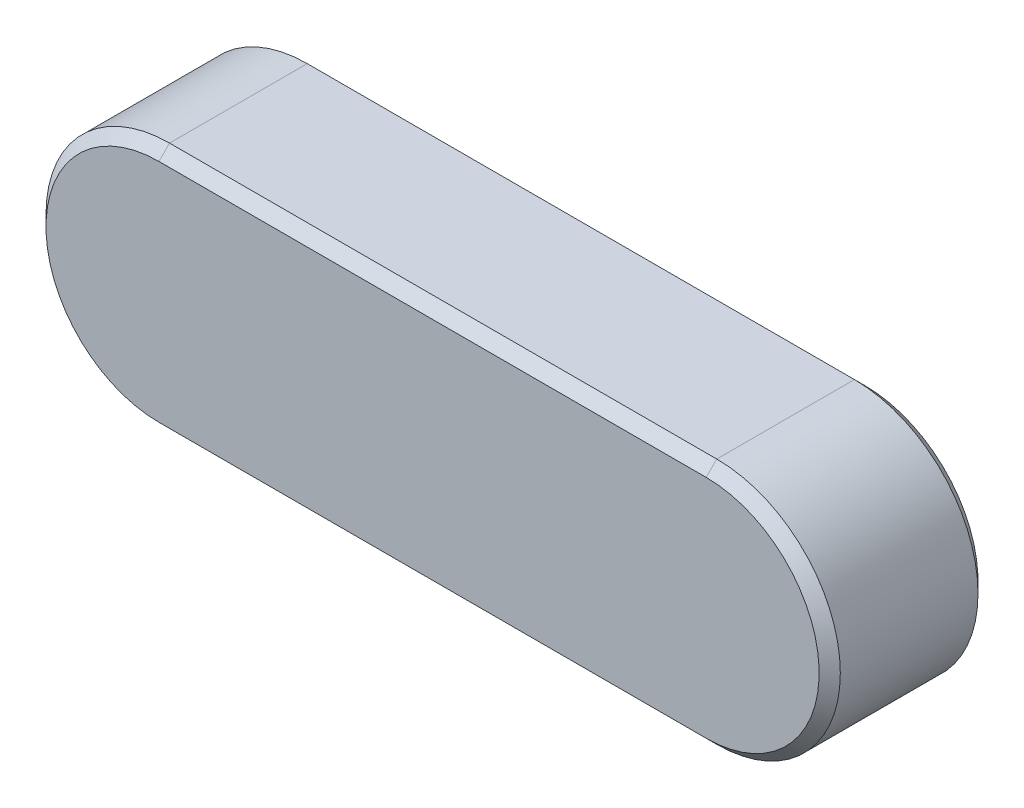
ISO-10303-21;
HEADER;
FILE_DESCRIPTION(('STEP AP214'),'2;1');
FILE_NAME('part.step','',(''),(''),'','','');
FILE_SCHEMA(('AUTOMOTIVE_DESIGN { 1 0 10303 214 1 1 1 1 }'));
ENDSEC;
DATA;
#1=APPLICATION_CONTEXT('core data for automotive mechanical design processes');
#2=APPLICATION_PROTOCOL_DEFINITION('international standard','automotive_design',2000,#1);
#3=PRODUCT_CONTEXT('',#1,'mechanical');
#4=PRODUCT('Part','Part','',(#3));
#5=PRODUCT_RELATED_PRODUCT_CATEGORY('part','',(#4));
#6=PRODUCT_DEFINITION_FORMATION('','',#4);
#7=PRODUCT_DEFINITION_CONTEXT('part definition',#1,'design');
#8=PRODUCT_DEFINITION('design','',#6,#7);
#9=PRODUCT_DEFINITION_SHAPE('','',#8);
#10=(LENGTH_UNIT() NAMED_UNIT(*) SI_UNIT(.MILLI.,.METRE.));
#11=(NAMED_UNIT(*) PLANE_ANGLE_UNIT() SI_UNIT($,.RADIAN.));
#12=(NAMED_UNIT(*) SI_UNIT($,.STERADIAN.) SOLID_ANGLE_UNIT());
#13=UNCERTAINTY_MEASURE_WITH_UNIT(LENGTH_MEASURE(1.E-05),#10,'distance_accuracy_value','');
#14=(GEOMETRIC_REPRESENTATION_CONTEXT(3) GLOBAL_UNCERTAINTY_ASSIGNED_CONTEXT((#13)) GLOBAL_UNIT_ASSIGNED_CONTEXT((#10,
#11,#12)) REPRESENTATION_CONTEXT('',''));
#15=CARTESIAN_POINT('',(0.,0.,0.));
#16=DIRECTION('',(0.,0.,1.));
#17=DIRECTION('',(1.,0.,0.));
#18=AXIS2_PLACEMENT_3D('',#15,#16,#17);
#19=CARTESIAN_POINT('',(-31.,0.,4.5));
#20=DIRECTION('',(0.,0.,-1.));
#21=DIRECTION('',(-1.,0.,0.));
#22=AXIS2_PLACEMENT_3D('',#19,#20,#21);
#23=CYLINDRICAL_SURFACE('',#22,7.);
#24=DIRECTION('',(0.,0.,-1.));
#25=VECTOR('',#24,1.);
#26=CARTESIAN_POINT('',(-31.,-7.,4.5));
#27=LINE('',#26,#25);
#28=CARTESIAN_POINT('',(-31.,-7.,3.9));
#29=VERTEX_POINT('',#28);
#30=CARTESIAN_POINT('',(-31.,-7.,-3.9));
#31=VERTEX_POINT('',#30);
#32=EDGE_CURVE('E126',#29,#31,#27,.T.);
#33=ORIENTED_EDGE('',*,*,#32,.F.);
#34=CARTESIAN_POINT('',(-31.,0.,3.9));
#35=DIRECTION('',(0.,0.,-1.));
#36=DIRECTION('',(-1.,0.,0.));
#37=AXIS2_PLACEMENT_3D('',#34,#35,#36);
#38=CIRCLE('',#37,7.);
#39=CARTESIAN_POINT('',(-31.,7.,3.9));
#40=VERTEX_POINT('',#39);
#41=EDGE_CURVE('E64',#29,#40,#38,.T.);
#42=ORIENTED_EDGE('',*,*,#41,.T.);
#43=DIRECTION('',(0.,0.,-1.));
#44=VECTOR('',#43,1.);
#45=CARTESIAN_POINT('',(-31.,7.,4.5));
#46=LINE('',#45,#44);
#47=CARTESIAN_POINT('',(-31.,7.,-3.9));
#48=VERTEX_POINT('',#47);
#49=EDGE_CURVE('E164',#40,#48,#46,.T.);
#50=ORIENTED_EDGE('',*,*,#49,.T.);
#51=CARTESIAN_POINT('',(-31.,0.,-3.9));
#52=DIRECTION('',(0.,0.,-1.));
#53=DIRECTION('',(-1.,0.,0.));
#54=AXIS2_PLACEMENT_3D('',#51,#52,#53);
#55=CIRCLE('',#54,7.);
#56=EDGE_CURVE('E114',#48,#31,#55,.F.);
#57=ORIENTED_EDGE('',*,*,#56,.T.);
#58=EDGE_LOOP('',(#33,#42,#50,#57));
#59=FACE_BOUND('',#58,.T.);
#60=ADVANCED_FACE('F36',(#59),#23,.T.);
#61=CARTESIAN_POINT('',(0.,-7.,4.5));
#62=DIRECTION('',(0.,1.,0.));
#63=DIRECTION('',(-1.,0.,0.));
#64=AXIS2_PLACEMENT_3D('',#61,#62,#63);
#65=PLANE('',#64);
#66=ORIENTED_EDGE('',*,*,#32,.T.);
#67=DIRECTION('',(1.,0.,0.));
#68=VECTOR('',#67,1.);
#69=CARTESIAN_POINT('',(0.,-7.,-3.9));
#70=LINE('',#69,#68);
#71=CARTESIAN_POINT('',(0.,-7.,-3.9));
#72=VERTEX_POINT('',#71);
#73=EDGE_CURVE('E129',#31,#72,#70,.T.);
#74=ORIENTED_EDGE('',*,*,#73,.T.);
#75=DIRECTION('',(0.,0.,-1.));
#76=VECTOR('',#75,1.);
#77=CARTESIAN_POINT('',(0.,-7.,4.5));
#78=LINE('',#77,#76);
#79=CARTESIAN_POINT('',(0.,-7.,3.9));
#80=VERTEX_POINT('',#79);
#81=EDGE_CURVE('E107',#80,#72,#78,.T.);
#82=ORIENTED_EDGE('',*,*,#81,.F.);
#83=DIRECTION('',(-1.,0.,0.));
#84=VECTOR('',#83,1.);
#85=CARTESIAN_POINT('',(0.,-7.,3.9));
#86=LINE('',#85,#84);
#87=EDGE_CURVE('E121',#80,#29,#86,.T.);
#88=ORIENTED_EDGE('',*,*,#87,.T.);
#89=EDGE_LOOP('',(#66,#74,#82,#88));
#90=FACE_BOUND('',#89,.T.);
#91=ADVANCED_FACE('F124',(#90),#65,.F.);
#92=CARTESIAN_POINT('',(0.,0.,4.5));
#93=DIRECTION('',(0.,0.,-1.));
#94=DIRECTION('',(-1.,0.,0.));
#95=AXIS2_PLACEMENT_3D('',#92,#93,#94);
#96=CYLINDRICAL_SURFACE('',#95,7.);
#97=DIRECTION('',(0.,0.,-1.));
#98=VECTOR('',#97,1.);
#99=CARTESIAN_POINT('',(0.,7.,4.5));
#100=LINE('',#99,#98);
#101=CARTESIAN_POINT('',(0.,7.,3.9));
#102=VERTEX_POINT('',#101);
#103=CARTESIAN_POINT('',(0.,7.,-3.9));
#104=VERTEX_POINT('',#103);
#105=EDGE_CURVE('E109',#102,#104,#100,.T.);
#106=ORIENTED_EDGE('',*,*,#105,.F.);
#107=CARTESIAN_POINT('',(0.,0.,3.9));
#108=DIRECTION('',(0.,0.,-1.));
#109=DIRECTION('',(-1.,0.,0.));
#110=AXIS2_PLACEMENT_3D('',#107,#108,#109);
#111=CIRCLE('',#110,7.);
#112=EDGE_CURVE('E106',#102,#80,#111,.T.);
#113=ORIENTED_EDGE('',*,*,#112,.T.);
#114=ORIENTED_EDGE('',*,*,#81,.T.);
#115=CARTESIAN_POINT('',(0.,0.,-3.9));
#116=DIRECTION('',(0.,0.,-1.));
#117=DIRECTION('',(-1.,0.,0.));
#118=AXIS2_PLACEMENT_3D('',#115,#116,#117);
#119=CIRCLE('',#118,7.);
#120=EDGE_CURVE('E116',#72,#104,#119,.F.);
#121=ORIENTED_EDGE('',*,*,#120,.T.);
#122=EDGE_LOOP('',(#106,#113,#114,#121));
#123=FACE_BOUND('',#122,.T.);
#124=ADVANCED_FACE('F108',(#123),#96,.T.);
#125=CARTESIAN_POINT('',(-31.,7.,4.5));
#126=DIRECTION('',(0.,-1.,0.));
#127=DIRECTION('',(1.,0.,0.));
#128=AXIS2_PLACEMENT_3D('',#125,#126,#127);
#129=PLANE('',#128);
#130=ORIENTED_EDGE('',*,*,#49,.F.);
#131=DIRECTION('',(1.,0.,0.));
#132=VECTOR('',#131,1.);
#133=CARTESIAN_POINT('',(-31.,7.,3.9));
#134=LINE('',#133,#132);
#135=EDGE_CURVE('E11',#40,#102,#134,.T.);
#136=ORIENTED_EDGE('',*,*,#135,.T.);
#137=ORIENTED_EDGE('',*,*,#105,.T.);
#138=DIRECTION('',(-1.,0.,0.));
#139=VECTOR('',#138,1.);
#140=CARTESIAN_POINT('',(-31.,7.,-3.9));
#141=LINE('',#140,#139);
#142=EDGE_CURVE('E50',#104,#48,#141,.T.);
#143=ORIENTED_EDGE('',*,*,#142,.T.);
#144=EDGE_LOOP('',(#130,#136,#137,#143));
#145=FACE_BOUND('',#144,.T.);
#146=ADVANCED_FACE('F212',(#145),#129,.F.);
#147=CARTESIAN_POINT('',(-31.,0.,4.5));
#148=DIRECTION('',(0.,0.,-1.));
#149=DIRECTION('',(-1.,0.,0.));
#150=AXIS2_PLACEMENT_3D('',#147,#148,#149);
#151=PLANE('',#150);
#152=CARTESIAN_POINT('',(-31.,0.,4.5));
#153=DIRECTION('',(0.,0.,-1.));
#154=DIRECTION('',(-1.,0.,0.));
#155=AXIS2_PLACEMENT_3D('',#152,#153,#154);
#156=CIRCLE('',#155,6.4);
#157=CARTESIAN_POINT('',(-31.,6.4,4.5));
#158=VERTEX_POINT('',#157);
#159=CARTESIAN_POINT('',(-31.,-6.4,4.5));
#160=VERTEX_POINT('',#159);
#161=EDGE_CURVE('E187',#158,#160,#156,.F.);
#162=ORIENTED_EDGE('',*,*,#161,.T.);
#163=DIRECTION('',(1.,0.,0.));
#164=VECTOR('',#163,1.);
#165=CARTESIAN_POINT('',(-31.,-6.4,4.5));
#166=LINE('',#165,#164);
#167=CARTESIAN_POINT('',(0.,-6.4,4.5));
#168=VERTEX_POINT('',#167);
#169=EDGE_CURVE('E186',#160,#168,#166,.T.);
#170=ORIENTED_EDGE('',*,*,#169,.T.);
#171=CARTESIAN_POINT('',(0.,0.,4.5));
#172=DIRECTION('',(0.,0.,-1.));
#173=DIRECTION('',(-1.,0.,0.));
#174=AXIS2_PLACEMENT_3D('',#171,#172,#173);
#175=CIRCLE('',#174,6.4);
#176=CARTESIAN_POINT('',(0.,6.4,4.5));
#177=VERTEX_POINT('',#176);
#178=EDGE_CURVE('E137',#168,#177,#175,.F.);
#179=ORIENTED_EDGE('',*,*,#178,.T.);
#180=DIRECTION('',(-1.,0.,0.));
#181=VECTOR('',#180,1.);
#182=CARTESIAN_POINT('',(-31.,6.4,4.5));
#183=LINE('',#182,#181);
#184=EDGE_CURVE('E183',#177,#158,#183,.T.);
#185=ORIENTED_EDGE('',*,*,#184,.T.);
#186=EDGE_LOOP('',(#162,#170,#179,#185));
#187=FACE_BOUND('',#186,.T.);
#188=ADVANCED_FACE('F216',(#187),#151,.F.);
#189=CARTESIAN_POINT('',(-31.,0.,-4.5));
#190=DIRECTION('',(0.,0.,-1.));
#191=DIRECTION('',(-1.,0.,0.));
#192=AXIS2_PLACEMENT_3D('',#189,#190,#191);
#193=PLANE('',#192);
#194=CARTESIAN_POINT('',(0.,0.,-4.5));
#195=DIRECTION('',(0.,0.,-1.));
#196=DIRECTION('',(-1.,0.,0.));
#197=AXIS2_PLACEMENT_3D('',#194,#195,#196);
#198=CIRCLE('',#197,6.4);
#199=CARTESIAN_POINT('',(0.,6.4,-4.5));
#200=VERTEX_POINT('',#199);
#201=CARTESIAN_POINT('',(0.,-6.4,-4.5));
#202=VERTEX_POINT('',#201);
#203=EDGE_CURVE('E177',#200,#202,#198,.T.);
#204=ORIENTED_EDGE('',*,*,#203,.T.);
#205=DIRECTION('',(-1.,0.,0.));
#206=VECTOR('',#205,1.);
#207=CARTESIAN_POINT('',(-31.,-6.4,-4.5));
#208=LINE('',#207,#206);
#209=CARTESIAN_POINT('',(-31.,-6.4,-4.5));
#210=VERTEX_POINT('',#209);
#211=EDGE_CURVE('E181',#202,#210,#208,.T.);
#212=ORIENTED_EDGE('',*,*,#211,.T.);
#213=CARTESIAN_POINT('',(-31.,0.,-4.5));
#214=DIRECTION('',(0.,0.,-1.));
#215=DIRECTION('',(-1.,0.,0.));
#216=AXIS2_PLACEMENT_3D('',#213,#214,#215);
#217=CIRCLE('',#216,6.4);
#218=CARTESIAN_POINT('',(-31.,6.4,-4.5));
#219=VERTEX_POINT('',#218);
#220=EDGE_CURVE('E180',#210,#219,#217,.T.);
#221=ORIENTED_EDGE('',*,*,#220,.T.);
#222=DIRECTION('',(1.,0.,0.));
#223=VECTOR('',#222,1.);
#224=CARTESIAN_POINT('',(0.,6.4,-4.5));
#225=LINE('',#224,#223);
#226=EDGE_CURVE('E174',#219,#200,#225,.T.);
#227=ORIENTED_EDGE('',*,*,#226,.T.);
#228=EDGE_LOOP('',(#204,#212,#221,#227));
#229=FACE_BOUND('',#228,.T.);
#230=ADVANCED_FACE('F217',(#229),#193,.T.);
#231=CARTESIAN_POINT('',(-31.,7.,-3.9));
#232=DIRECTION('',(0.,0.707106781186547,-0.707106781186547));
#233=DIRECTION('',(0.,0.707106781186548,0.707106781186548));
#234=AXIS2_PLACEMENT_3D('',#231,#232,#233);
#235=PLANE('',#234);
#236=DIRECTION('',(0.,0.707106781186547,0.707106781186547));
#237=VECTOR('',#236,1.);
#238=CARTESIAN_POINT('',(0.,6.4,-4.5));
#239=LINE('',#238,#237);
#240=EDGE_CURVE('E160',#200,#104,#239,.T.);
#241=ORIENTED_EDGE('',*,*,#240,.F.);
#242=ORIENTED_EDGE('',*,*,#226,.F.);
#243=DIRECTION('',(0.,-0.707106781186547,-0.707106781186547));
#244=VECTOR('',#243,1.);
#245=CARTESIAN_POINT('',(-31.,7.,-3.9));
#246=LINE('',#245,#244);
#247=EDGE_CURVE('E144',#48,#219,#246,.T.);
#248=ORIENTED_EDGE('',*,*,#247,.F.);
#249=ORIENTED_EDGE('',*,*,#142,.F.);
#250=EDGE_LOOP('',(#241,#242,#248,#249));
#251=FACE_BOUND('',#250,.T.);
#252=ADVANCED_FACE('F225',(#251),#235,.T.);
#253=CARTESIAN_POINT('',(-31.,0.,-3.9));
#254=DIRECTION('',(0.,0.,1.));
#255=DIRECTION('',(1.,0.,0.));
#256=AXIS2_PLACEMENT_3D('',#253,#254,#255);
#257=CONICAL_SURFACE('',#256,7.,0.785398163397448);
#258=ORIENTED_EDGE('',*,*,#247,.T.);
#259=ORIENTED_EDGE('',*,*,#220,.F.);
#260=DIRECTION('',(0.,0.707106781186547,-0.707106781186547));
#261=VECTOR('',#260,1.);
#262=CARTESIAN_POINT('',(-31.,-7.,-3.9));
#263=LINE('',#262,#261);
#264=EDGE_CURVE('E153',#31,#210,#263,.T.);
#265=ORIENTED_EDGE('',*,*,#264,.F.);
#266=ORIENTED_EDGE('',*,*,#56,.F.);
#267=EDGE_LOOP('',(#258,#259,#265,#266));
#268=FACE_BOUND('',#267,.T.);
#269=ADVANCED_FACE('F193',(#268),#257,.T.);
#270=CARTESIAN_POINT('',(0.,0.,-3.9));
#271=DIRECTION('',(0.,0.,1.));
#272=DIRECTION('',(1.,0.,0.));
#273=AXIS2_PLACEMENT_3D('',#270,#271,#272);
#274=CONICAL_SURFACE('',#273,7.,0.785398163397448);
#275=ORIENTED_EDGE('',*,*,#240,.T.);
#276=ORIENTED_EDGE('',*,*,#120,.F.);
#277=DIRECTION('',(0.,-0.707106781186547,0.707106781186547));
#278=VECTOR('',#277,1.);
#279=CARTESIAN_POINT('',(0.,-6.4,-4.5));
#280=LINE('',#279,#278);
#281=EDGE_CURVE('E146',#202,#72,#280,.T.);
#282=ORIENTED_EDGE('',*,*,#281,.F.);
#283=ORIENTED_EDGE('',*,*,#203,.F.);
#284=EDGE_LOOP('',(#275,#276,#282,#283));
#285=FACE_BOUND('',#284,.T.);
#286=ADVANCED_FACE('F200',(#285),#274,.T.);
#287=CARTESIAN_POINT('',(0.,-7.,-3.9));
#288=DIRECTION('',(0.,-0.707106781186548,-0.707106781186548));
#289=DIRECTION('',(0.,0.707106781186548,-0.707106781186548));
#290=AXIS2_PLACEMENT_3D('',#287,#288,#289);
#291=PLANE('',#290);
#292=ORIENTED_EDGE('',*,*,#264,.T.);
#293=ORIENTED_EDGE('',*,*,#211,.F.);
#294=ORIENTED_EDGE('',*,*,#281,.T.);
#295=ORIENTED_EDGE('',*,*,#73,.F.);
#296=EDGE_LOOP('',(#292,#293,#294,#295));
#297=FACE_BOUND('',#296,.T.);
#298=ADVANCED_FACE('F192',(#297),#291,.T.);
#299=CARTESIAN_POINT('',(-31.,6.4,4.5));
#300=DIRECTION('',(0.,-0.707106781186547,-0.707106781186547));
#301=DIRECTION('',(0.,0.707106781186548,-0.707106781186548));
#302=AXIS2_PLACEMENT_3D('',#299,#300,#301);
#303=PLANE('',#302);
#304=DIRECTION('',(0.,-0.707106781186547,0.707106781186547));
#305=VECTOR('',#304,1.);
#306=CARTESIAN_POINT('',(0.,7.,3.9));
#307=LINE('',#306,#305);
#308=EDGE_CURVE('E142',#102,#177,#307,.T.);
#309=ORIENTED_EDGE('',*,*,#308,.F.);
#310=ORIENTED_EDGE('',*,*,#135,.F.);
#311=DIRECTION('',(0.,0.707106781186547,-0.707106781186547));
#312=VECTOR('',#311,1.);
#313=CARTESIAN_POINT('',(-31.,6.4,4.5));
#314=LINE('',#313,#312);
#315=EDGE_CURVE('E45',#158,#40,#314,.T.);
#316=ORIENTED_EDGE('',*,*,#315,.F.);
#317=ORIENTED_EDGE('',*,*,#184,.F.);
#318=EDGE_LOOP('',(#309,#310,#316,#317));
#319=FACE_BOUND('',#318,.T.);
#320=ADVANCED_FACE('F37',(#319),#303,.F.);
#321=CARTESIAN_POINT('',(-31.,0.,4.5));
#322=DIRECTION('',(0.,0.,-1.));
#323=DIRECTION('',(-1.,0.,0.));
#324=AXIS2_PLACEMENT_3D('',#321,#322,#323);
#325=CONICAL_SURFACE('',#324,6.4,0.785398163397448);
#326=ORIENTED_EDGE('',*,*,#315,.T.);
#327=ORIENTED_EDGE('',*,*,#41,.F.);
#328=DIRECTION('',(0.,-0.707106781186547,-0.707106781186547));
#329=VECTOR('',#328,1.);
#330=CARTESIAN_POINT('',(-31.,-6.4,4.5));
#331=LINE('',#330,#329);
#332=EDGE_CURVE('E134',#160,#29,#331,.T.);
#333=ORIENTED_EDGE('',*,*,#332,.F.);
#334=ORIENTED_EDGE('',*,*,#161,.F.);
#335=EDGE_LOOP('',(#326,#327,#333,#334));
#336=FACE_BOUND('',#335,.T.);
#337=ADVANCED_FACE('F202',(#336),#325,.T.);
#338=CARTESIAN_POINT('',(0.,0.,4.5));
#339=DIRECTION('',(0.,0.,-1.));
#340=DIRECTION('',(-1.,0.,0.));
#341=AXIS2_PLACEMENT_3D('',#338,#339,#340);
#342=CONICAL_SURFACE('',#341,6.4,0.785398163397448);
#343=ORIENTED_EDGE('',*,*,#308,.T.);
#344=ORIENTED_EDGE('',*,*,#178,.F.);
#345=DIRECTION('',(0.,0.707106781186547,0.707106781186547));
#346=VECTOR('',#345,1.);
#347=CARTESIAN_POINT('',(0.,-7.,3.9));
#348=LINE('',#347,#346);
#349=EDGE_CURVE('E135',#80,#168,#348,.T.);
#350=ORIENTED_EDGE('',*,*,#349,.F.);
#351=ORIENTED_EDGE('',*,*,#112,.F.);
#352=EDGE_LOOP('',(#343,#344,#350,#351));
#353=FACE_BOUND('',#352,.T.);
#354=ADVANCED_FACE('F139',(#353),#342,.T.);
#355=CARTESIAN_POINT('',(-31.,-6.4,4.5));
#356=DIRECTION('',(0.,0.707106781186547,-0.707106781186547));
#357=DIRECTION('',(0.,0.707106781186548,0.707106781186548));
#358=AXIS2_PLACEMENT_3D('',#355,#356,#357);
#359=PLANE('',#358);
#360=ORIENTED_EDGE('',*,*,#332,.T.);
#361=ORIENTED_EDGE('',*,*,#87,.F.);
#362=ORIENTED_EDGE('',*,*,#349,.T.);
#363=ORIENTED_EDGE('',*,*,#169,.F.);
#364=EDGE_LOOP('',(#360,#361,#362,#363));
#365=FACE_BOUND('',#364,.T.);
#366=ADVANCED_FACE('F127',(#365),#359,.F.);
#367=CLOSED_SHELL('',(#60,#91,#124,#146,#188,#230,#252,#269,#286,#298,#320,#337,#354,#366));
#368=MANIFOLD_SOLID_BREP('B2',#367);
#369=ADVANCED_BREP_SHAPE_REPRESENTATION('',(#18,#368),#14);
#370=SHAPE_DEFINITION_REPRESENTATION(#9,#369);
ENDSEC;
END-ISO-10303-21;
